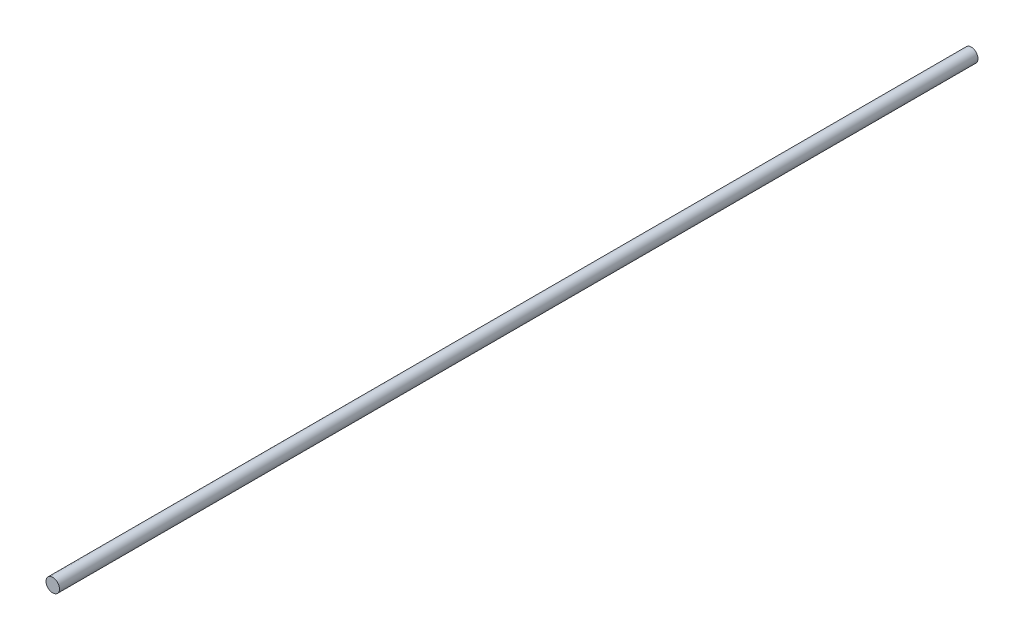
ISO-10303-21;
HEADER;
FILE_DESCRIPTION(('STEP AP214'),'2;1');
FILE_NAME('part.step','',(''),(''),'','','');
FILE_SCHEMA(('AUTOMOTIVE_DESIGN { 1 0 10303 214 1 1 1 1 }'));
ENDSEC;
DATA;
#1=APPLICATION_CONTEXT('core data for automotive mechanical design processes');
#2=APPLICATION_PROTOCOL_DEFINITION('international standard','automotive_design',2000,#1);
#3=PRODUCT_CONTEXT('',#1,'mechanical');
#4=PRODUCT('Part','Part','',(#3));
#5=PRODUCT_RELATED_PRODUCT_CATEGORY('part','',(#4));
#6=PRODUCT_DEFINITION_FORMATION('','',#4);
#7=PRODUCT_DEFINITION_CONTEXT('part definition',#1,'design');
#8=PRODUCT_DEFINITION('design','',#6,#7);
#9=PRODUCT_DEFINITION_SHAPE('','',#8);
#10=(LENGTH_UNIT() NAMED_UNIT(*) SI_UNIT(.MILLI.,.METRE.));
#11=(NAMED_UNIT(*) PLANE_ANGLE_UNIT() SI_UNIT($,.RADIAN.));
#12=(NAMED_UNIT(*) SI_UNIT($,.STERADIAN.) SOLID_ANGLE_UNIT());
#13=UNCERTAINTY_MEASURE_WITH_UNIT(LENGTH_MEASURE(1.E-05),#10,'distance_accuracy_value','');
#14=(GEOMETRIC_REPRESENTATION_CONTEXT(3) GLOBAL_UNCERTAINTY_ASSIGNED_CONTEXT((#13)) GLOBAL_UNIT_ASSIGNED_CONTEXT((#10,
#11,#12)) REPRESENTATION_CONTEXT('',''));
#15=CARTESIAN_POINT('',(0.,0.,0.));
#16=DIRECTION('',(0.,0.,1.));
#17=DIRECTION('',(1.,0.,0.));
#18=AXIS2_PLACEMENT_3D('',#15,#16,#17);
#19=CARTESIAN_POINT('',(0.,0.,544.));
#20=DIRECTION('',(0.,0.,-1.));
#21=DIRECTION('',(-1.,0.,0.));
#22=AXIS2_PLACEMENT_3D('',#19,#20,#21);
#23=CYLINDRICAL_SURFACE('',#22,4.);
#24=CARTESIAN_POINT('',(0.,0.,544.));
#25=DIRECTION('',(0.,0.,1.));
#26=DIRECTION('',(1.,0.,0.));
#27=AXIS2_PLACEMENT_3D('',#24,#25,#26);
#28=CIRCLE('',#27,4.);
#29=CARTESIAN_POINT('',(4.,0.,544.));
#30=VERTEX_POINT('',#29);
#31=EDGE_CURVE('E10',#30,#30,#28,.T.);
#32=ORIENTED_EDGE('',*,*,#31,.F.);
#33=EDGE_LOOP('',(#32));
#34=FACE_BOUND('',#33,.T.);
#35=CARTESIAN_POINT('',(0.,0.,0.));
#36=DIRECTION('',(0.,0.,1.));
#37=DIRECTION('',(1.,0.,0.));
#38=AXIS2_PLACEMENT_3D('',#35,#36,#37);
#39=CIRCLE('',#38,4.);
#40=CARTESIAN_POINT('',(4.,0.,0.));
#41=VERTEX_POINT('',#40);
#42=EDGE_CURVE('E35',#41,#41,#39,.T.);
#43=ORIENTED_EDGE('',*,*,#42,.T.);
#44=EDGE_LOOP('',(#43));
#45=FACE_BOUND('',#44,.T.);
#46=ADVANCED_FACE('F32',(#34,#45),#23,.T.);
#47=CARTESIAN_POINT('',(0.,0.,544.));
#48=DIRECTION('',(0.,0.,1.));
#49=DIRECTION('',(1.,0.,0.));
#50=AXIS2_PLACEMENT_3D('',#47,#48,#49);
#51=PLANE('',#50);
#52=ORIENTED_EDGE('',*,*,#31,.T.);
#53=EDGE_LOOP('',(#52));
#54=FACE_BOUND('',#53,.T.);
#55=ADVANCED_FACE('F47',(#54),#51,.T.);
#56=CARTESIAN_POINT('',(0.,0.,0.));
#57=DIRECTION('',(0.,0.,1.));
#58=DIRECTION('',(1.,0.,0.));
#59=AXIS2_PLACEMENT_3D('',#56,#57,#58);
#60=PLANE('',#59);
#61=ORIENTED_EDGE('',*,*,#42,.F.);
#62=EDGE_LOOP('',(#61));
#63=FACE_BOUND('',#62,.T.);
#64=ADVANCED_FACE('F45',(#63),#60,.F.);
#65=CLOSED_SHELL('',(#46,#55,#64));
#66=MANIFOLD_SOLID_BREP('B2',#65);
#67=ADVANCED_BREP_SHAPE_REPRESENTATION('',(#18,#66),#14);
#68=SHAPE_DEFINITION_REPRESENTATION(#9,#67);
ENDSEC;
END-ISO-10303-21;
